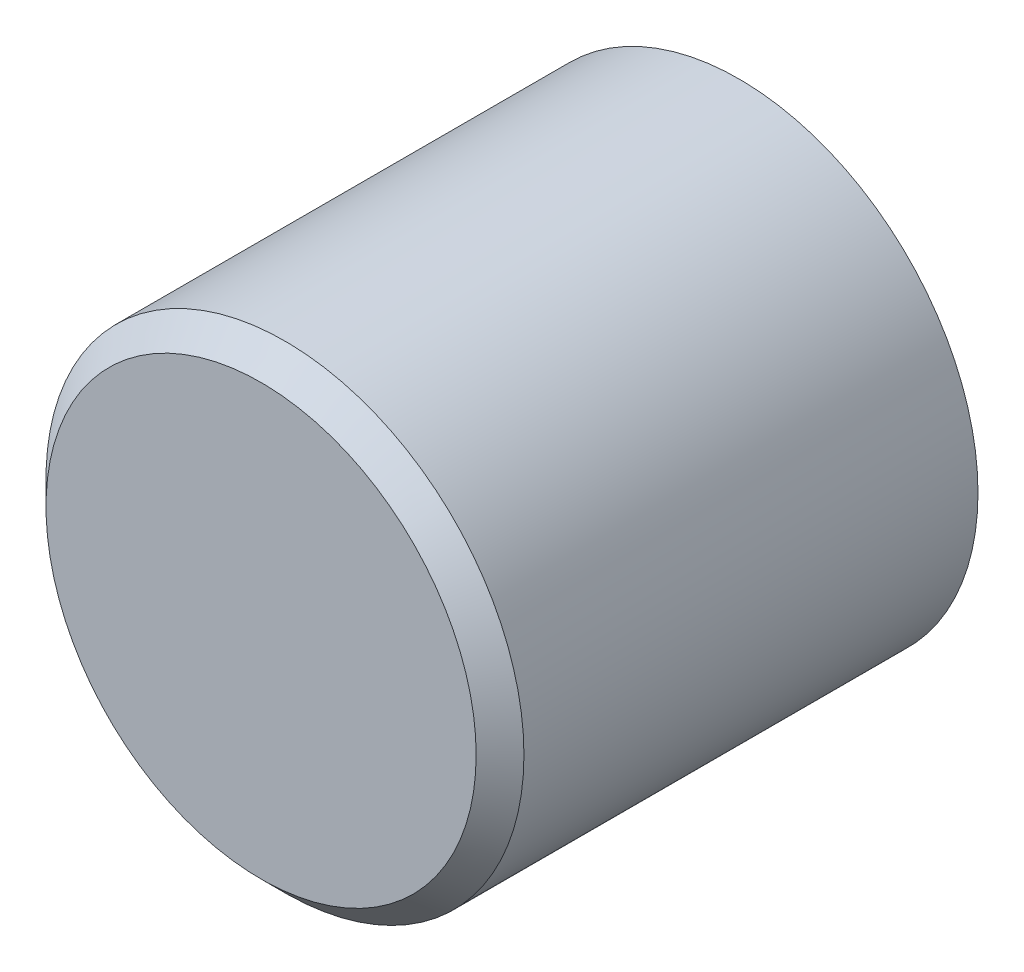
ISO-10303-21;
HEADER;
FILE_DESCRIPTION(('STEP AP214'),'2;1');
FILE_NAME('part.step','',(''),(''),'','','');
FILE_SCHEMA(('AUTOMOTIVE_DESIGN { 1 0 10303 214 1 1 1 1 }'));
ENDSEC;
DATA;
#1=APPLICATION_CONTEXT('core data for automotive mechanical design processes');
#2=APPLICATION_PROTOCOL_DEFINITION('international standard','automotive_design',2000,#1);
#3=PRODUCT_CONTEXT('',#1,'mechanical');
#4=PRODUCT('Part','Part','',(#3));
#5=PRODUCT_RELATED_PRODUCT_CATEGORY('part','',(#4));
#6=PRODUCT_DEFINITION_FORMATION('','',#4);
#7=PRODUCT_DEFINITION_CONTEXT('part definition',#1,'design');
#8=PRODUCT_DEFINITION('design','',#6,#7);
#9=PRODUCT_DEFINITION_SHAPE('','',#8);
#10=(LENGTH_UNIT() NAMED_UNIT(*) SI_UNIT(.MILLI.,.METRE.));
#11=(NAMED_UNIT(*) PLANE_ANGLE_UNIT() SI_UNIT($,.RADIAN.));
#12=(NAMED_UNIT(*) SI_UNIT($,.STERADIAN.) SOLID_ANGLE_UNIT());
#13=UNCERTAINTY_MEASURE_WITH_UNIT(LENGTH_MEASURE(1.E-05),#10,'distance_accuracy_value','');
#14=(GEOMETRIC_REPRESENTATION_CONTEXT(3) GLOBAL_UNCERTAINTY_ASSIGNED_CONTEXT((#13)) GLOBAL_UNIT_ASSIGNED_CONTEXT((#10,
#11,#12)) REPRESENTATION_CONTEXT('',''));
#15=CARTESIAN_POINT('',(0.,0.,0.));
#16=DIRECTION('',(0.,0.,1.));
#17=DIRECTION('',(1.,0.,0.));
#18=AXIS2_PLACEMENT_3D('',#15,#16,#17);
#19=CARTESIAN_POINT('',(0.,0.,2.));
#20=DIRECTION('',(0.,0.,-1.));
#21=DIRECTION('',(-1.,0.,0.));
#22=AXIS2_PLACEMENT_3D('',#19,#20,#21);
#23=CYLINDRICAL_SURFACE('',#22,1.);
#24=CARTESIAN_POINT('',(0.,0.,1.9));
#25=DIRECTION('',(0.,0.,1.));
#26=DIRECTION('',(1.,0.,0.));
#27=AXIS2_PLACEMENT_3D('',#24,#25,#26);
#28=CIRCLE('',#27,1.);
#29=CARTESIAN_POINT('',(1.,0.,1.9));
#30=VERTEX_POINT('',#29);
#31=EDGE_CURVE('E10',#30,#30,#28,.F.);
#32=ORIENTED_EDGE('',*,*,#31,.T.);
#33=EDGE_LOOP('',(#32));
#34=FACE_BOUND('',#33,.T.);
#35=CARTESIAN_POINT('',(0.,0.,0.));
#36=DIRECTION('',(0.,0.,1.));
#37=DIRECTION('',(1.,0.,0.));
#38=AXIS2_PLACEMENT_3D('',#35,#36,#37);
#39=CIRCLE('',#38,1.);
#40=CARTESIAN_POINT('',(1.,0.,0.));
#41=VERTEX_POINT('',#40);
#42=EDGE_CURVE('E42',#41,#41,#39,.T.);
#43=ORIENTED_EDGE('',*,*,#42,.T.);
#44=EDGE_LOOP('',(#43));
#45=FACE_BOUND('',#44,.T.);
#46=ADVANCED_FACE('F31',(#34,#45),#23,.T.);
#47=CARTESIAN_POINT('',(0.,0.,2.));
#48=DIRECTION('',(0.,0.,1.));
#49=DIRECTION('',(1.,0.,0.));
#50=AXIS2_PLACEMENT_3D('',#47,#48,#49);
#51=PLANE('',#50);
#52=CARTESIAN_POINT('',(0.,0.,2.));
#53=DIRECTION('',(0.,0.,1.));
#54=DIRECTION('',(1.,0.,0.));
#55=AXIS2_PLACEMENT_3D('',#52,#53,#54);
#56=CIRCLE('',#55,0.899999999999999);
#57=CARTESIAN_POINT('',(0.899999999999999,0.,2.));
#58=VERTEX_POINT('',#57);
#59=EDGE_CURVE('E38',#58,#58,#56,.T.);
#60=ORIENTED_EDGE('',*,*,#59,.T.);
#61=EDGE_LOOP('',(#60));
#62=FACE_BOUND('',#61,.T.);
#63=ADVANCED_FACE('F52',(#62),#51,.T.);
#64=CARTESIAN_POINT('',(0.,0.,0.));
#65=DIRECTION('',(0.,0.,1.));
#66=DIRECTION('',(1.,0.,0.));
#67=AXIS2_PLACEMENT_3D('',#64,#65,#66);
#68=PLANE('',#67);
#69=ORIENTED_EDGE('',*,*,#42,.F.);
#70=EDGE_LOOP('',(#69));
#71=FACE_BOUND('',#70,.T.);
#72=ADVANCED_FACE('F50',(#71),#68,.F.);
#73=CARTESIAN_POINT('',(0.,0.,2.));
#74=DIRECTION('',(0.,0.,-1.));
#75=DIRECTION('',(-1.,0.,0.));
#76=AXIS2_PLACEMENT_3D('',#73,#74,#75);
#77=CONICAL_SURFACE('',#76,0.899999999999999,0.785398163397448);
#78=ORIENTED_EDGE('',*,*,#31,.F.);
#79=EDGE_LOOP('',(#78));
#80=FACE_BOUND('',#79,.T.);
#81=ORIENTED_EDGE('',*,*,#59,.F.);
#82=EDGE_LOOP('',(#81));
#83=FACE_BOUND('',#82,.T.);
#84=ADVANCED_FACE('F33',(#80,#83),#77,.T.);
#85=CLOSED_SHELL('',(#46,#63,#72,#84));
#86=MANIFOLD_SOLID_BREP('B2',#85);
#87=ADVANCED_BREP_SHAPE_REPRESENTATION('',(#18,#86),#14);
#88=SHAPE_DEFINITION_REPRESENTATION(#9,#87);
ENDSEC;
END-ISO-10303-21;
